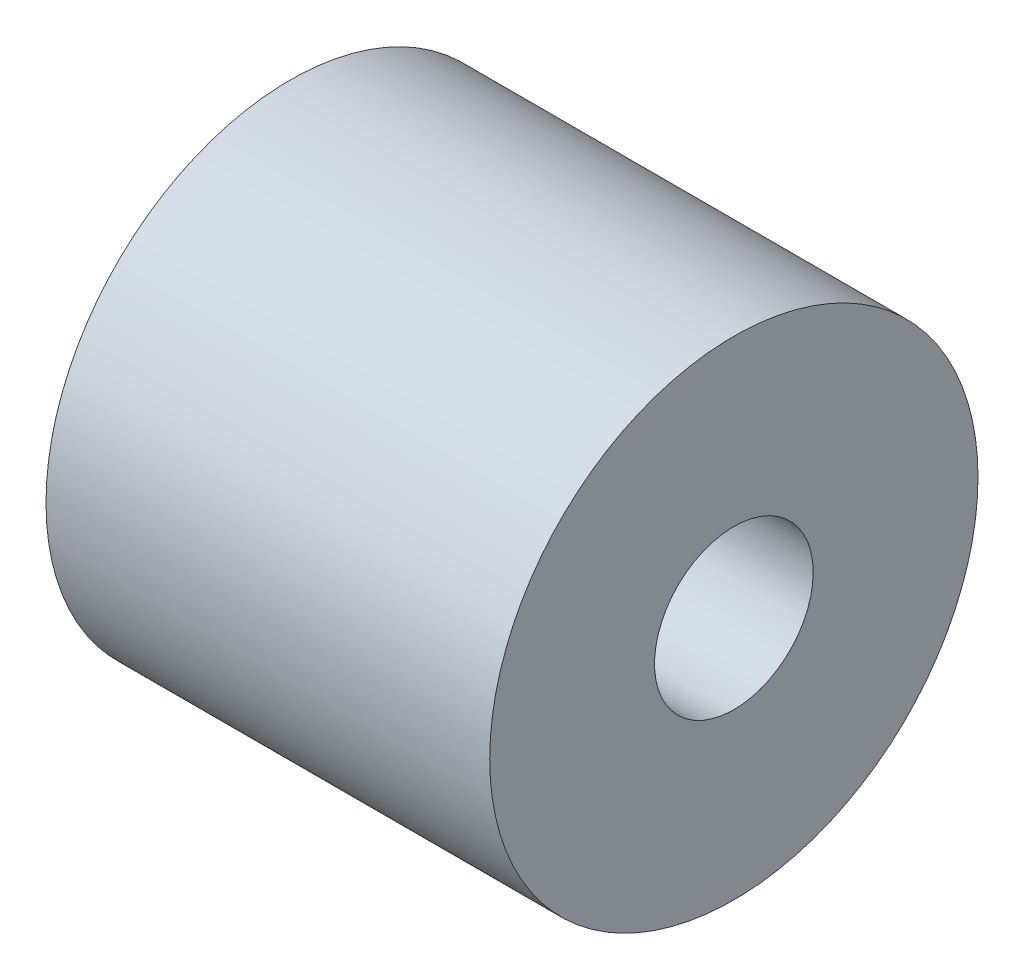
ISO-10303-21;
HEADER;
FILE_DESCRIPTION(('STEP AP214'),'2;1');
FILE_NAME('part.step','',(''),(''),'','','');
FILE_SCHEMA(('AUTOMOTIVE_DESIGN { 1 0 10303 214 1 1 1 1 }'));
ENDSEC;
DATA;
#1=APPLICATION_CONTEXT('core data for automotive mechanical design processes');
#2=APPLICATION_PROTOCOL_DEFINITION('international standard','automotive_design',2000,#1);
#3=PRODUCT_CONTEXT('',#1,'mechanical');
#4=PRODUCT('Part','Part','',(#3));
#5=PRODUCT_RELATED_PRODUCT_CATEGORY('part','',(#4));
#6=PRODUCT_DEFINITION_FORMATION('','',#4);
#7=PRODUCT_DEFINITION_CONTEXT('part definition',#1,'design');
#8=PRODUCT_DEFINITION('design','',#6,#7);
#9=PRODUCT_DEFINITION_SHAPE('','',#8);
#10=(LENGTH_UNIT() NAMED_UNIT(*) SI_UNIT(.MILLI.,.METRE.));
#11=(NAMED_UNIT(*) PLANE_ANGLE_UNIT() SI_UNIT($,.RADIAN.));
#12=(NAMED_UNIT(*) SI_UNIT($,.STERADIAN.) SOLID_ANGLE_UNIT());
#13=UNCERTAINTY_MEASURE_WITH_UNIT(LENGTH_MEASURE(1.E-05),#10,'distance_accuracy_value','');
#14=(GEOMETRIC_REPRESENTATION_CONTEXT(3) GLOBAL_UNCERTAINTY_ASSIGNED_CONTEXT((#13)) GLOBAL_UNIT_ASSIGNED_CONTEXT((#10,
#11,#12)) REPRESENTATION_CONTEXT('',''));
#15=CARTESIAN_POINT('',(0.,0.,0.));
#16=DIRECTION('',(0.,0.,1.));
#17=DIRECTION('',(1.,0.,0.));
#18=AXIS2_PLACEMENT_3D('',#15,#16,#17);
#19=CARTESIAN_POINT('',(18.175,0.,0.));
#20=DIRECTION('',(1.,0.,0.));
#21=DIRECTION('',(0.,0.,-1.));
#22=AXIS2_PLACEMENT_3D('',#19,#20,#21);
#23=PLANE('',#22);
#24=CARTESIAN_POINT('',(18.175,0.,0.));
#25=DIRECTION('',(1.,0.,0.));
#26=DIRECTION('',(0.,0.,-1.));
#27=AXIS2_PLACEMENT_3D('',#24,#25,#26);
#28=CIRCLE('',#27,10.);
#29=CARTESIAN_POINT('',(18.175,0.,-10.));
#30=VERTEX_POINT('',#29);
#31=EDGE_CURVE('E10',#30,#30,#28,.T.);
#32=ORIENTED_EDGE('',*,*,#31,.T.);
#33=EDGE_LOOP('',(#32));
#34=FACE_BOUND('',#33,.T.);
#35=CARTESIAN_POINT('',(18.175,0.,0.));
#36=DIRECTION('',(1.,0.,0.));
#37=DIRECTION('',(0.,0.,-1.));
#38=AXIS2_PLACEMENT_3D('',#35,#36,#37);
#39=CIRCLE('',#38,3.25);
#40=CARTESIAN_POINT('',(18.175,0.,-3.25));
#41=VERTEX_POINT('',#40);
#42=EDGE_CURVE('E50',#41,#41,#39,.T.);
#43=ORIENTED_EDGE('',*,*,#42,.F.);
#44=EDGE_LOOP('',(#43));
#45=FACE_BOUND('',#44,.T.);
#46=ADVANCED_FACE('F37',(#34,#45),#23,.T.);
#47=CARTESIAN_POINT('',(0.,0.,0.));
#48=DIRECTION('',(1.,0.,0.));
#49=DIRECTION('',(0.,0.,-1.));
#50=AXIS2_PLACEMENT_3D('',#47,#48,#49);
#51=PLANE('',#50);
#52=CARTESIAN_POINT('',(0.,0.,0.));
#53=DIRECTION('',(1.,0.,0.));
#54=DIRECTION('',(0.,0.,-1.));
#55=AXIS2_PLACEMENT_3D('',#52,#53,#54);
#56=CIRCLE('',#55,10.);
#57=CARTESIAN_POINT('',(0.,0.,-10.));
#58=VERTEX_POINT('',#57);
#59=EDGE_CURVE('E41',#58,#58,#56,.T.);
#60=ORIENTED_EDGE('',*,*,#59,.F.);
#61=EDGE_LOOP('',(#60));
#62=FACE_BOUND('',#61,.T.);
#63=CARTESIAN_POINT('',(0.,0.,0.));
#64=DIRECTION('',(1.,0.,0.));
#65=DIRECTION('',(0.,0.,-1.));
#66=AXIS2_PLACEMENT_3D('',#63,#64,#65);
#67=CIRCLE('',#66,3.25);
#68=CARTESIAN_POINT('',(0.,0.,-3.25));
#69=VERTEX_POINT('',#68);
#70=EDGE_CURVE('E52',#69,#69,#67,.T.);
#71=ORIENTED_EDGE('',*,*,#70,.T.);
#72=EDGE_LOOP('',(#71));
#73=FACE_BOUND('',#72,.T.);
#74=ADVANCED_FACE('F64',(#62,#73),#51,.F.);
#75=CARTESIAN_POINT('',(18.175,0.,0.));
#76=DIRECTION('',(-1.,0.,0.));
#77=DIRECTION('',(0.,0.,1.));
#78=AXIS2_PLACEMENT_3D('',#75,#76,#77);
#79=CYLINDRICAL_SURFACE('',#78,10.);
#80=ORIENTED_EDGE('',*,*,#31,.F.);
#81=EDGE_LOOP('',(#80));
#82=FACE_BOUND('',#81,.T.);
#83=ORIENTED_EDGE('',*,*,#59,.T.);
#84=EDGE_LOOP('',(#83));
#85=FACE_BOUND('',#84,.T.);
#86=ADVANCED_FACE('F39',(#82,#85),#79,.T.);
#87=CARTESIAN_POINT('',(18.175,0.,0.));
#88=DIRECTION('',(-1.,0.,0.));
#89=DIRECTION('',(0.,0.,1.));
#90=AXIS2_PLACEMENT_3D('',#87,#88,#89);
#91=CYLINDRICAL_SURFACE('',#90,3.25);
#92=ORIENTED_EDGE('',*,*,#42,.T.);
#93=EDGE_LOOP('',(#92));
#94=FACE_BOUND('',#93,.T.);
#95=ORIENTED_EDGE('',*,*,#70,.F.);
#96=EDGE_LOOP('',(#95));
#97=FACE_BOUND('',#96,.T.);
#98=ADVANCED_FACE('F60',(#94,#97),#91,.F.);
#99=CLOSED_SHELL('',(#46,#74,#86,#98));
#100=MANIFOLD_SOLID_BREP('B2',#99);
#101=ADVANCED_BREP_SHAPE_REPRESENTATION('',(#18,#100),#14);
#102=SHAPE_DEFINITION_REPRESENTATION(#9,#101);
ENDSEC;
END-ISO-10303-21;
